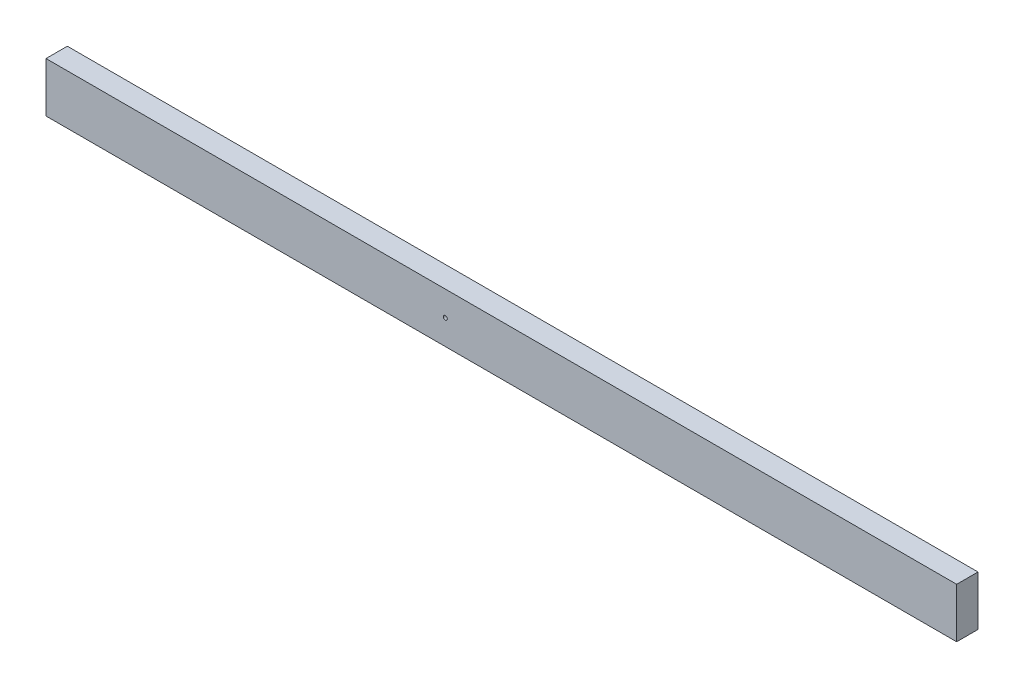
ISO-10303-21;
HEADER;
FILE_DESCRIPTION(('STEP AP214'),'2;1');
FILE_NAME('part.step','',(''),(''),'','','');
FILE_SCHEMA(('AUTOMOTIVE_DESIGN { 1 0 10303 214 1 1 1 1 }'));
ENDSEC;
DATA;
#1=APPLICATION_CONTEXT('core data for automotive mechanical design processes');
#2=APPLICATION_PROTOCOL_DEFINITION('international standard','automotive_design',2000,#1);
#3=PRODUCT_CONTEXT('',#1,'mechanical');
#4=PRODUCT('Part','Part','',(#3));
#5=PRODUCT_RELATED_PRODUCT_CATEGORY('part','',(#4));
#6=PRODUCT_DEFINITION_FORMATION('','',#4);
#7=PRODUCT_DEFINITION_CONTEXT('part definition',#1,'design');
#8=PRODUCT_DEFINITION('design','',#6,#7);
#9=PRODUCT_DEFINITION_SHAPE('','',#8);
#10=(LENGTH_UNIT() NAMED_UNIT(*) SI_UNIT(.MILLI.,.METRE.));
#11=(NAMED_UNIT(*) PLANE_ANGLE_UNIT() SI_UNIT($,.RADIAN.));
#12=(NAMED_UNIT(*) SI_UNIT($,.STERADIAN.) SOLID_ANGLE_UNIT());
#13=UNCERTAINTY_MEASURE_WITH_UNIT(LENGTH_MEASURE(1.E-05),#10,'distance_accuracy_value','');
#14=(GEOMETRIC_REPRESENTATION_CONTEXT(3) GLOBAL_UNCERTAINTY_ASSIGNED_CONTEXT((#13)) GLOBAL_UNIT_ASSIGNED_CONTEXT((#10,
#11,#12)) REPRESENTATION_CONTEXT('',''));
#15=CARTESIAN_POINT('',(0.,0.,0.));
#16=DIRECTION('',(0.,0.,1.));
#17=DIRECTION('',(1.,0.,0.));
#18=AXIS2_PLACEMENT_3D('',#15,#16,#17);
#19=CARTESIAN_POINT('',(1625.6,-44.45,-19.05));
#20=DIRECTION('',(0.,0.,1.));
#21=DIRECTION('',(1.,0.,0.));
#22=AXIS2_PLACEMENT_3D('',#19,#20,#21);
#23=PLANE('',#22);
#24=CARTESIAN_POINT('',(712.7875,0.,-19.05));
#25=DIRECTION('',(0.,0.,1.));
#26=DIRECTION('',(1.,0.,0.));
#27=AXIS2_PLACEMENT_3D('',#24,#25,#26);
#28=CIRCLE('',#27,3.571875);
#29=CARTESIAN_POINT('',(716.359375,0.,-19.05));
#30=VERTEX_POINT('',#29);
#31=EDGE_CURVE('E103',#30,#30,#28,.T.);
#32=ORIENTED_EDGE('',*,*,#31,.T.);
#33=EDGE_LOOP('',(#32));
#34=FACE_BOUND('',#33,.T.);
#35=DIRECTION('',(0.,1.,0.));
#36=VECTOR('',#35,1.);
#37=CARTESIAN_POINT('',(0.,-44.45,-19.05));
#38=LINE('',#37,#36);
#39=CARTESIAN_POINT('',(0.,-44.45,-19.05));
#40=VERTEX_POINT('',#39);
#41=CARTESIAN_POINT('',(0.,44.45,-19.05));
#42=VERTEX_POINT('',#41);
#43=EDGE_CURVE('E100',#40,#42,#38,.T.);
#44=ORIENTED_EDGE('',*,*,#43,.T.);
#45=DIRECTION('',(-1.,0.,0.));
#46=VECTOR('',#45,1.);
#47=CARTESIAN_POINT('',(1625.6,44.45,-19.05));
#48=LINE('',#47,#46);
#49=CARTESIAN_POINT('',(1625.6,44.45,-19.05));
#50=VERTEX_POINT('',#49);
#51=EDGE_CURVE('E11',#50,#42,#48,.T.);
#52=ORIENTED_EDGE('',*,*,#51,.F.);
#53=DIRECTION('',(0.,1.,0.));
#54=VECTOR('',#53,1.);
#55=CARTESIAN_POINT('',(1625.6,-44.45,-19.05));
#56=LINE('',#55,#54);
#57=CARTESIAN_POINT('',(1625.6,-44.45,-19.05));
#58=VERTEX_POINT('',#57);
#59=EDGE_CURVE('E88',#58,#50,#56,.T.);
#60=ORIENTED_EDGE('',*,*,#59,.F.);
#61=DIRECTION('',(-1.,0.,0.));
#62=VECTOR('',#61,1.);
#63=CARTESIAN_POINT('',(1625.6,-44.45,-19.05));
#64=LINE('',#63,#62);
#65=EDGE_CURVE('E96',#58,#40,#64,.T.);
#66=ORIENTED_EDGE('',*,*,#65,.T.);
#67=EDGE_LOOP('',(#44,#52,#60,#66));
#68=FACE_BOUND('',#67,.T.);
#69=ADVANCED_FACE('F37',(#34,#68),#23,.F.);
#70=CARTESIAN_POINT('',(1625.6,44.45,19.05));
#71=DIRECTION('',(0.,-1.,0.));
#72=DIRECTION('',(0.,0.,-1.));
#73=AXIS2_PLACEMENT_3D('',#70,#71,#72);
#74=PLANE('',#73);
#75=DIRECTION('',(0.,0.,1.));
#76=VECTOR('',#75,1.);
#77=CARTESIAN_POINT('',(0.,44.45,19.05));
#78=LINE('',#77,#76);
#79=CARTESIAN_POINT('',(0.,44.45,19.05));
#80=VERTEX_POINT('',#79);
#81=EDGE_CURVE('E92',#42,#80,#78,.T.);
#82=ORIENTED_EDGE('',*,*,#81,.T.);
#83=DIRECTION('',(-1.,0.,0.));
#84=VECTOR('',#83,1.);
#85=CARTESIAN_POINT('',(1625.6,44.45,19.05));
#86=LINE('',#85,#84);
#87=CARTESIAN_POINT('',(1625.6,44.45,19.05));
#88=VERTEX_POINT('',#87);
#89=EDGE_CURVE('E45',#88,#80,#86,.T.);
#90=ORIENTED_EDGE('',*,*,#89,.F.);
#91=DIRECTION('',(0.,0.,1.));
#92=VECTOR('',#91,1.);
#93=CARTESIAN_POINT('',(1625.6,44.45,19.05));
#94=LINE('',#93,#92);
#95=EDGE_CURVE('E83',#50,#88,#94,.T.);
#96=ORIENTED_EDGE('',*,*,#95,.F.);
#97=ORIENTED_EDGE('',*,*,#51,.T.);
#98=EDGE_LOOP('',(#82,#90,#96,#97));
#99=FACE_BOUND('',#98,.T.);
#100=ADVANCED_FACE('F91',(#99),#74,.F.);
#101=CARTESIAN_POINT('',(1625.6,-44.45,19.05));
#102=DIRECTION('',(0.,0.,-1.));
#103=DIRECTION('',(-1.,0.,0.));
#104=AXIS2_PLACEMENT_3D('',#101,#102,#103);
#105=PLANE('',#104);
#106=CARTESIAN_POINT('',(712.7875,0.,19.05));
#107=DIRECTION('',(0.,0.,1.));
#108=DIRECTION('',(1.,0.,0.));
#109=AXIS2_PLACEMENT_3D('',#106,#107,#108);
#110=CIRCLE('',#109,3.571875);
#111=CARTESIAN_POINT('',(716.359375,0.,19.05));
#112=VERTEX_POINT('',#111);
#113=EDGE_CURVE('E116',#112,#112,#110,.T.);
#114=ORIENTED_EDGE('',*,*,#113,.F.);
#115=EDGE_LOOP('',(#114));
#116=FACE_BOUND('',#115,.T.);
#117=DIRECTION('',(0.,-1.,0.));
#118=VECTOR('',#117,1.);
#119=CARTESIAN_POINT('',(0.,-44.45,19.05));
#120=LINE('',#119,#118);
#121=CARTESIAN_POINT('',(0.,-44.45,19.05));
#122=VERTEX_POINT('',#121);
#123=EDGE_CURVE('E70',#80,#122,#120,.T.);
#124=ORIENTED_EDGE('',*,*,#123,.T.);
#125=DIRECTION('',(-1.,0.,0.));
#126=VECTOR('',#125,1.);
#127=CARTESIAN_POINT('',(1625.6,-44.45,19.05));
#128=LINE('',#127,#126);
#129=CARTESIAN_POINT('',(1625.6,-44.45,19.05));
#130=VERTEX_POINT('',#129);
#131=EDGE_CURVE('E93',#130,#122,#128,.T.);
#132=ORIENTED_EDGE('',*,*,#131,.F.);
#133=DIRECTION('',(0.,-1.,0.));
#134=VECTOR('',#133,1.);
#135=CARTESIAN_POINT('',(1625.6,-44.45,19.05));
#136=LINE('',#135,#134);
#137=EDGE_CURVE('E86',#88,#130,#136,.T.);
#138=ORIENTED_EDGE('',*,*,#137,.F.);
#139=ORIENTED_EDGE('',*,*,#89,.T.);
#140=EDGE_LOOP('',(#124,#132,#138,#139));
#141=FACE_BOUND('',#140,.T.);
#142=ADVANCED_FACE('F94',(#116,#141),#105,.F.);
#143=CARTESIAN_POINT('',(1625.6,-44.45,19.05));
#144=DIRECTION('',(0.,1.,0.));
#145=DIRECTION('',(0.,0.,1.));
#146=AXIS2_PLACEMENT_3D('',#143,#144,#145);
#147=PLANE('',#146);
#148=DIRECTION('',(0.,0.,-1.));
#149=VECTOR('',#148,1.);
#150=CARTESIAN_POINT('',(0.,-44.45,19.05));
#151=LINE('',#150,#149);
#152=EDGE_CURVE('E76',#122,#40,#151,.T.);
#153=ORIENTED_EDGE('',*,*,#152,.T.);
#154=ORIENTED_EDGE('',*,*,#65,.F.);
#155=DIRECTION('',(0.,0.,-1.));
#156=VECTOR('',#155,1.);
#157=CARTESIAN_POINT('',(1625.6,-44.45,19.05));
#158=LINE('',#157,#156);
#159=EDGE_CURVE('E53',#130,#58,#158,.T.);
#160=ORIENTED_EDGE('',*,*,#159,.F.);
#161=ORIENTED_EDGE('',*,*,#131,.T.);
#162=EDGE_LOOP('',(#153,#154,#160,#161));
#163=FACE_BOUND('',#162,.T.);
#164=ADVANCED_FACE('F108',(#163),#147,.F.);
#165=CARTESIAN_POINT('',(1625.6,0.,0.));
#166=DIRECTION('',(-1.,0.,0.));
#167=DIRECTION('',(0.,0.,1.));
#168=AXIS2_PLACEMENT_3D('',#165,#166,#167);
#169=PLANE('',#168);
#170=ORIENTED_EDGE('',*,*,#59,.T.);
#171=ORIENTED_EDGE('',*,*,#95,.T.);
#172=ORIENTED_EDGE('',*,*,#137,.T.);
#173=ORIENTED_EDGE('',*,*,#159,.T.);
#174=EDGE_LOOP('',(#170,#171,#172,#173));
#175=FACE_BOUND('',#174,.T.);
#176=ADVANCED_FACE('F84',(#175),#169,.F.);
#177=CARTESIAN_POINT('',(0.,0.,0.));
#178=DIRECTION('',(-1.,0.,0.));
#179=DIRECTION('',(0.,0.,1.));
#180=AXIS2_PLACEMENT_3D('',#177,#178,#179);
#181=PLANE('',#180);
#182=ORIENTED_EDGE('',*,*,#43,.F.);
#183=ORIENTED_EDGE('',*,*,#152,.F.);
#184=ORIENTED_EDGE('',*,*,#123,.F.);
#185=ORIENTED_EDGE('',*,*,#81,.F.);
#186=EDGE_LOOP('',(#182,#183,#184,#185));
#187=FACE_BOUND('',#186,.T.);
#188=ADVANCED_FACE('F111',(#187),#181,.T.);
#189=CARTESIAN_POINT('',(712.7875,0.,19.05));
#190=DIRECTION('',(0.,0.,1.));
#191=DIRECTION('',(1.,0.,0.));
#192=AXIS2_PLACEMENT_3D('',#189,#190,#191);
#193=CYLINDRICAL_SURFACE('',#192,3.571875);
#194=ORIENTED_EDGE('',*,*,#31,.F.);
#195=EDGE_LOOP('',(#194));
#196=FACE_BOUND('',#195,.T.);
#197=ORIENTED_EDGE('',*,*,#113,.T.);
#198=EDGE_LOOP('',(#197));
#199=FACE_BOUND('',#198,.T.);
#200=ADVANCED_FACE('F120',(#196,#199),#193,.F.);
#201=CLOSED_SHELL('',(#69,#100,#142,#164,#176,#188,#200));
#202=MANIFOLD_SOLID_BREP('B2',#201);
#203=ADVANCED_BREP_SHAPE_REPRESENTATION('',(#18,#202),#14);
#204=SHAPE_DEFINITION_REPRESENTATION(#9,#203);
ENDSEC;
END-ISO-10303-21;
